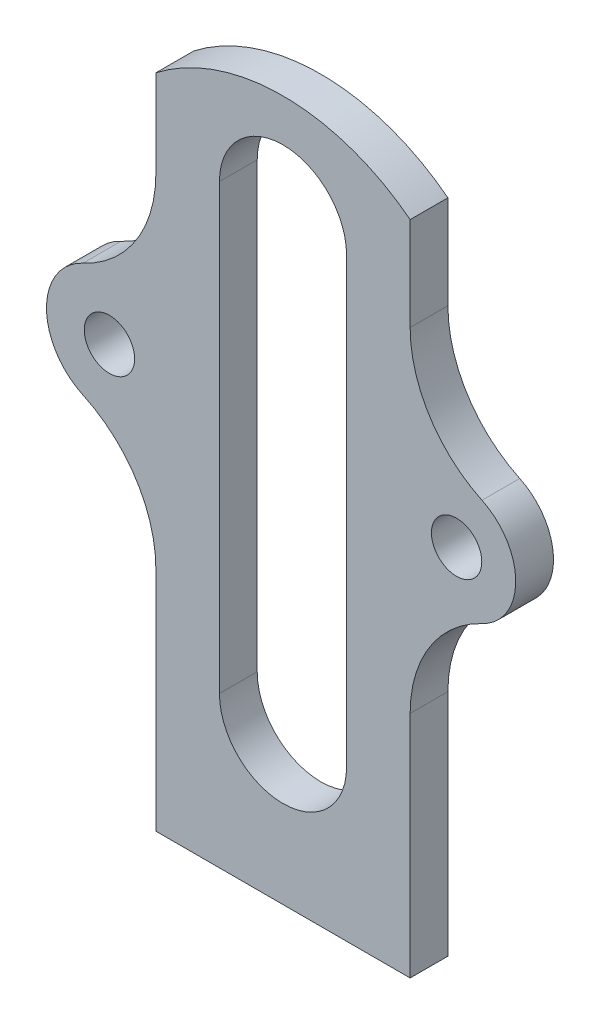
ISO-10303-21;
HEADER;
FILE_DESCRIPTION(('STEP AP214'),'2;1');
FILE_NAME('part.step','',(''),(''),'','','');
FILE_SCHEMA(('AUTOMOTIVE_DESIGN { 1 0 10303 214 1 1 1 1 }'));
ENDSEC;
DATA;
#1=APPLICATION_CONTEXT('core data for automotive mechanical design processes');
#2=APPLICATION_PROTOCOL_DEFINITION('international standard','automotive_design',2000,#1);
#3=PRODUCT_CONTEXT('',#1,'mechanical');
#4=PRODUCT('Part','Part','',(#3));
#5=PRODUCT_RELATED_PRODUCT_CATEGORY('part','',(#4));
#6=PRODUCT_DEFINITION_FORMATION('','',#4);
#7=PRODUCT_DEFINITION_CONTEXT('part definition',#1,'design');
#8=PRODUCT_DEFINITION('design','',#6,#7);
#9=PRODUCT_DEFINITION_SHAPE('','',#8);
#10=(LENGTH_UNIT() NAMED_UNIT(*) SI_UNIT(.MILLI.,.METRE.));
#11=(NAMED_UNIT(*) PLANE_ANGLE_UNIT() SI_UNIT($,.RADIAN.));
#12=(NAMED_UNIT(*) SI_UNIT($,.STERADIAN.) SOLID_ANGLE_UNIT());
#13=UNCERTAINTY_MEASURE_WITH_UNIT(LENGTH_MEASURE(1.E-05),#10,'distance_accuracy_value','');
#14=(GEOMETRIC_REPRESENTATION_CONTEXT(3) GLOBAL_UNCERTAINTY_ASSIGNED_CONTEXT((#13)) GLOBAL_UNIT_ASSIGNED_CONTEXT((#10,
#11,#12)) REPRESENTATION_CONTEXT('',''));
#15=CARTESIAN_POINT('',(0.,0.,0.));
#16=DIRECTION('',(0.,0.,1.));
#17=DIRECTION('',(1.,0.,0.));
#18=AXIS2_PLACEMENT_3D('',#15,#16,#17);
#19=CARTESIAN_POINT('',(0.,18.041981199993,23.));
#20=DIRECTION('',(-1.,0.,0.));
#21=DIRECTION('',(0.,-1.,0.));
#22=AXIS2_PLACEMENT_3D('',#19,#20,#21);
#23=PLANE('',#22);
#24=DIRECTION('',(0.,-1.,0.));
#25=VECTOR('',#24,1.);
#26=CARTESIAN_POINT('',(0.,18.041981199993,26.));
#27=LINE('',#26,#25);
#28=CARTESIAN_POINT('',(0.,18.041981199993,26.));
#29=VERTEX_POINT('',#28);
#30=CARTESIAN_POINT('',(0.,-1.07552855510562E-13,26.));
#31=VERTEX_POINT('',#30);
#32=EDGE_CURVE('E183',#29,#31,#27,.T.);
#33=ORIENTED_EDGE('',*,*,#32,.F.);
#34=DIRECTION('',(0.,0.,1.));
#35=VECTOR('',#34,1.);
#36=CARTESIAN_POINT('',(0.,18.041981199993,23.));
#37=LINE('',#36,#35);
#38=CARTESIAN_POINT('',(0.,18.041981199993,23.));
#39=VERTEX_POINT('',#38);
#40=EDGE_CURVE('E11',#39,#29,#37,.T.);
#41=ORIENTED_EDGE('',*,*,#40,.F.);
#42=DIRECTION('',(0.,-1.,0.));
#43=VECTOR('',#42,1.);
#44=CARTESIAN_POINT('',(0.,18.041981199993,23.));
#45=LINE('',#44,#43);
#46=CARTESIAN_POINT('',(0.,-1.07552855510562E-13,23.));
#47=VERTEX_POINT('',#46);
#48=EDGE_CURVE('E187',#39,#47,#45,.T.);
#49=ORIENTED_EDGE('',*,*,#48,.T.);
#50=DIRECTION('',(0.,0.,1.));
#51=VECTOR('',#50,1.);
#52=CARTESIAN_POINT('',(0.,-1.07552855510562E-13,23.));
#53=LINE('',#52,#51);
#54=EDGE_CURVE('E36',#47,#31,#53,.T.);
#55=ORIENTED_EDGE('',*,*,#54,.T.);
#56=EDGE_LOOP('',(#33,#41,#49,#55));
#57=FACE_BOUND('',#56,.T.);
#58=ADVANCED_FACE('F33',(#57),#23,.T.);
#59=CARTESIAN_POINT('',(-10.,18.041981199993,23.));
#60=DIRECTION('',(0.,0.,1.));
#61=DIRECTION('',(1.,0.,0.));
#62=AXIS2_PLACEMENT_3D('',#59,#60,#61);
#63=CYLINDRICAL_SURFACE('',#62,10.);
#64=CARTESIAN_POINT('',(-10.,18.041981199993,26.));
#65=DIRECTION('',(0.,0.,-1.));
#66=DIRECTION('',(1.,0.,0.));
#67=AXIS2_PLACEMENT_3D('',#64,#65,#66);
#68=CIRCLE('',#67,10.);
#69=CARTESIAN_POINT('',(-5.79333333333333,27.1141339519894,26.));
#70=VERTEX_POINT('',#69);
#71=EDGE_CURVE('E191',#70,#29,#68,.T.);
#72=ORIENTED_EDGE('',*,*,#71,.F.);
#73=DIRECTION('',(0.,0.,1.));
#74=VECTOR('',#73,1.);
#75=CARTESIAN_POINT('',(-5.79333333333333,27.1141339519894,23.));
#76=LINE('',#75,#74);
#77=CARTESIAN_POINT('',(-5.79333333333333,27.1141339519894,23.));
#78=VERTEX_POINT('',#77);
#79=EDGE_CURVE('E41',#78,#70,#76,.T.);
#80=ORIENTED_EDGE('',*,*,#79,.F.);
#81=CARTESIAN_POINT('',(-10.,18.041981199993,23.));
#82=DIRECTION('',(0.,0.,-1.));
#83=DIRECTION('',(1.,0.,0.));
#84=AXIS2_PLACEMENT_3D('',#81,#82,#83);
#85=CIRCLE('',#84,10.);
#86=EDGE_CURVE('E221',#78,#39,#85,.T.);
#87=ORIENTED_EDGE('',*,*,#86,.T.);
#88=ORIENTED_EDGE('',*,*,#40,.T.);
#89=EDGE_LOOP('',(#72,#80,#87,#88));
#90=FACE_BOUND('',#89,.T.);
#91=ADVANCED_FACE('F288',(#90),#63,.F.);
#92=CARTESIAN_POINT('',(-3.69,31.6502103279876,23.));
#93=DIRECTION('',(0.,0.,1.));
#94=DIRECTION('',(1.,0.,0.));
#95=AXIS2_PLACEMENT_3D('',#92,#93,#94);
#96=CYLINDRICAL_SURFACE('',#95,5.);
#97=CARTESIAN_POINT('',(-3.69,31.6502103279876,26.));
#98=DIRECTION('',(0.,0.,1.));
#99=DIRECTION('',(1.,0.,0.));
#100=AXIS2_PLACEMENT_3D('',#97,#98,#99);
#101=CIRCLE('',#100,5.);
#102=CARTESIAN_POINT('',(-5.79333333333333,36.1862867039858,26.));
#103=VERTEX_POINT('',#102);
#104=EDGE_CURVE('E253',#103,#70,#101,.T.);
#105=ORIENTED_EDGE('',*,*,#104,.F.);
#106=DIRECTION('',(0.,0.,1.));
#107=VECTOR('',#106,1.);
#108=CARTESIAN_POINT('',(-5.79333333333333,36.1862867039858,23.));
#109=LINE('',#108,#107);
#110=CARTESIAN_POINT('',(-5.79333333333333,36.1862867039858,23.));
#111=VERTEX_POINT('',#110);
#112=EDGE_CURVE('E259',#111,#103,#109,.T.);
#113=ORIENTED_EDGE('',*,*,#112,.F.);
#114=CARTESIAN_POINT('',(-3.69,31.6502103279876,23.));
#115=DIRECTION('',(0.,0.,1.));
#116=DIRECTION('',(1.,0.,0.));
#117=AXIS2_PLACEMENT_3D('',#114,#115,#116);
#118=CIRCLE('',#117,5.);
#119=EDGE_CURVE('E218',#111,#78,#118,.T.);
#120=ORIENTED_EDGE('',*,*,#119,.T.);
#121=ORIENTED_EDGE('',*,*,#79,.T.);
#122=EDGE_LOOP('',(#105,#113,#120,#121));
#123=FACE_BOUND('',#122,.T.);
#124=ADVANCED_FACE('F323',(#123),#96,.T.);
#125=CARTESIAN_POINT('',(-10.,45.2584394559822,23.));
#126=DIRECTION('',(0.,0.,1.));
#127=DIRECTION('',(1.,0.,0.));
#128=AXIS2_PLACEMENT_3D('',#125,#126,#127);
#129=CYLINDRICAL_SURFACE('',#128,10.);
#130=CARTESIAN_POINT('',(-10.,45.2584394559822,26.));
#131=DIRECTION('',(0.,0.,-1.));
#132=DIRECTION('',(-1.,0.,0.));
#133=AXIS2_PLACEMENT_3D('',#130,#131,#132);
#134=CIRCLE('',#133,10.);
#135=CARTESIAN_POINT('',(0.,45.2584394559822,26.));
#136=VERTEX_POINT('',#135);
#137=EDGE_CURVE('E250',#136,#103,#134,.T.);
#138=ORIENTED_EDGE('',*,*,#137,.F.);
#139=DIRECTION('',(0.,0.,1.));
#140=VECTOR('',#139,1.);
#141=CARTESIAN_POINT('',(0.,45.2584394559822,23.));
#142=LINE('',#141,#140);
#143=CARTESIAN_POINT('',(0.,45.2584394559822,23.));
#144=VERTEX_POINT('',#143);
#145=EDGE_CURVE('E261',#144,#136,#142,.T.);
#146=ORIENTED_EDGE('',*,*,#145,.F.);
#147=CARTESIAN_POINT('',(-10.,45.2584394559822,23.));
#148=DIRECTION('',(0.,0.,-1.));
#149=DIRECTION('',(-1.,0.,0.));
#150=AXIS2_PLACEMENT_3D('',#147,#148,#149);
#151=CIRCLE('',#150,10.);
#152=EDGE_CURVE('E215',#144,#111,#151,.T.);
#153=ORIENTED_EDGE('',*,*,#152,.T.);
#154=ORIENTED_EDGE('',*,*,#112,.T.);
#155=EDGE_LOOP('',(#138,#146,#153,#154));
#156=FACE_BOUND('',#155,.T.);
#157=ADVANCED_FACE('F320',(#156),#129,.F.);
#158=CARTESIAN_POINT('',(0.,52.1796300253283,23.));
#159=DIRECTION('',(-1.,0.,0.));
#160=DIRECTION('',(0.,-1.,0.));
#161=AXIS2_PLACEMENT_3D('',#158,#159,#160);
#162=PLANE('',#161);
#163=DIRECTION('',(0.,-1.,0.));
#164=VECTOR('',#163,1.);
#165=CARTESIAN_POINT('',(0.,52.1796300253283,26.));
#166=LINE('',#165,#164);
#167=CARTESIAN_POINT('',(0.,52.1796300253283,26.));
#168=VERTEX_POINT('',#167);
#169=EDGE_CURVE('E247',#168,#136,#166,.T.);
#170=ORIENTED_EDGE('',*,*,#169,.F.);
#171=DIRECTION('',(0.,0.,1.));
#172=VECTOR('',#171,1.);
#173=CARTESIAN_POINT('',(0.,52.1796300253283,23.));
#174=LINE('',#173,#172);
#175=CARTESIAN_POINT('',(0.,52.1796300253283,23.));
#176=VERTEX_POINT('',#175);
#177=EDGE_CURVE('E263',#176,#168,#174,.T.);
#178=ORIENTED_EDGE('',*,*,#177,.F.);
#179=DIRECTION('',(0.,-1.,0.));
#180=VECTOR('',#179,1.);
#181=CARTESIAN_POINT('',(0.,52.1796300253283,23.));
#182=LINE('',#181,#180);
#183=EDGE_CURVE('E212',#176,#144,#182,.T.);
#184=ORIENTED_EDGE('',*,*,#183,.T.);
#185=ORIENTED_EDGE('',*,*,#145,.T.);
#186=EDGE_LOOP('',(#170,#178,#184,#185));
#187=FACE_BOUND('',#186,.T.);
#188=ADVANCED_FACE('F317',(#187),#162,.T.);
#189=CARTESIAN_POINT('',(10.1,39.1850926484792,23.));
#190=DIRECTION('',(0.,0.,1.));
#191=DIRECTION('',(1.,0.,0.));
#192=AXIS2_PLACEMENT_3D('',#189,#190,#191);
#193=CYLINDRICAL_SURFACE('',#192,16.4580679801224);
#194=CARTESIAN_POINT('',(10.1,39.1850926484792,26.));
#195=DIRECTION('',(0.,0.,1.));
#196=DIRECTION('',(1.,0.,0.));
#197=AXIS2_PLACEMENT_3D('',#194,#195,#196);
#198=CIRCLE('',#197,16.4580679801224);
#199=CARTESIAN_POINT('',(20.2,52.1796300253283,26.));
#200=VERTEX_POINT('',#199);
#201=EDGE_CURVE('E244',#200,#168,#198,.T.);
#202=ORIENTED_EDGE('',*,*,#201,.F.);
#203=DIRECTION('',(0.,0.,1.));
#204=VECTOR('',#203,1.);
#205=CARTESIAN_POINT('',(20.2,52.1796300253283,23.));
#206=LINE('',#205,#204);
#207=CARTESIAN_POINT('',(20.2,52.1796300253283,23.));
#208=VERTEX_POINT('',#207);
#209=EDGE_CURVE('E265',#208,#200,#206,.T.);
#210=ORIENTED_EDGE('',*,*,#209,.F.);
#211=CARTESIAN_POINT('',(10.1,39.1850926484792,23.));
#212=DIRECTION('',(0.,0.,1.));
#213=DIRECTION('',(1.,0.,0.));
#214=AXIS2_PLACEMENT_3D('',#211,#212,#213);
#215=CIRCLE('',#214,16.4580679801224);
#216=EDGE_CURVE('E209',#208,#176,#215,.T.);
#217=ORIENTED_EDGE('',*,*,#216,.T.);
#218=ORIENTED_EDGE('',*,*,#177,.T.);
#219=EDGE_LOOP('',(#202,#210,#217,#218));
#220=FACE_BOUND('',#219,.T.);
#221=ADVANCED_FACE('F313',(#220),#193,.T.);
#222=CARTESIAN_POINT('',(20.2,44.754426549422,23.));
#223=DIRECTION('',(1.,0.,0.));
#224=DIRECTION('',(0.,1.,0.));
#225=AXIS2_PLACEMENT_3D('',#222,#223,#224);
#226=PLANE('',#225);
#227=DIRECTION('',(0.,1.,0.));
#228=VECTOR('',#227,1.);
#229=CARTESIAN_POINT('',(20.2,44.754426549422,26.));
#230=LINE('',#229,#228);
#231=CARTESIAN_POINT('',(20.2,44.754426549422,26.));
#232=VERTEX_POINT('',#231);
#233=EDGE_CURVE('E241',#232,#200,#230,.T.);
#234=ORIENTED_EDGE('',*,*,#233,.F.);
#235=DIRECTION('',(0.,0.,1.));
#236=VECTOR('',#235,1.);
#237=CARTESIAN_POINT('',(20.2,44.754426549422,23.));
#238=LINE('',#237,#236);
#239=CARTESIAN_POINT('',(20.2,44.754426549422,23.));
#240=VERTEX_POINT('',#239);
#241=EDGE_CURVE('E267',#240,#232,#238,.T.);
#242=ORIENTED_EDGE('',*,*,#241,.F.);
#243=DIRECTION('',(0.,1.,0.));
#244=VECTOR('',#243,1.);
#245=CARTESIAN_POINT('',(20.2,44.754426549422,23.));
#246=LINE('',#245,#244);
#247=EDGE_CURVE('E206',#240,#208,#246,.T.);
#248=ORIENTED_EDGE('',*,*,#247,.T.);
#249=ORIENTED_EDGE('',*,*,#209,.T.);
#250=EDGE_LOOP('',(#234,#242,#248,#249));
#251=FACE_BOUND('',#250,.T.);
#252=ADVANCED_FACE('F309',(#251),#226,.T.);
#253=CARTESIAN_POINT('',(30.2,44.754426549422,23.));
#254=DIRECTION('',(0.,0.,1.));
#255=DIRECTION('',(1.,0.,0.));
#256=AXIS2_PLACEMENT_3D('',#253,#254,#255);
#257=CYLINDRICAL_SURFACE('',#256,10.);
#258=CARTESIAN_POINT('',(30.2,44.754426549422,26.));
#259=DIRECTION('',(0.,0.,-1.));
#260=DIRECTION('',(1.,0.,0.));
#261=AXIS2_PLACEMENT_3D('',#258,#259,#260);
#262=CIRCLE('',#261,10.);
#263=CARTESIAN_POINT('',(25.9066936686278,35.7229526528202,26.));
#264=VERTEX_POINT('',#263);
#265=EDGE_CURVE('E238',#264,#232,#262,.T.);
#266=ORIENTED_EDGE('',*,*,#265,.F.);
#267=DIRECTION('',(0.,0.,1.));
#268=VECTOR('',#267,1.);
#269=CARTESIAN_POINT('',(25.9066936686278,35.7229526528202,23.));
#270=LINE('',#269,#268);
#271=CARTESIAN_POINT('',(25.9066936686278,35.7229526528202,23.));
#272=VERTEX_POINT('',#271);
#273=EDGE_CURVE('E269',#272,#264,#270,.T.);
#274=ORIENTED_EDGE('',*,*,#273,.F.);
#275=CARTESIAN_POINT('',(30.2,44.754426549422,23.));
#276=DIRECTION('',(0.,0.,-1.));
#277=DIRECTION('',(1.,0.,0.));
#278=AXIS2_PLACEMENT_3D('',#275,#276,#277);
#279=CIRCLE('',#278,10.);
#280=EDGE_CURVE('E203',#272,#240,#279,.T.);
#281=ORIENTED_EDGE('',*,*,#280,.T.);
#282=ORIENTED_EDGE('',*,*,#241,.T.);
#283=EDGE_LOOP('',(#266,#274,#281,#282));
#284=FACE_BOUND('',#283,.T.);
#285=ADVANCED_FACE('F305',(#284),#257,.F.);
#286=CARTESIAN_POINT('',(23.89,31.4806007636569,23.));
#287=DIRECTION('',(0.,0.,1.));
#288=DIRECTION('',(1.,0.,0.));
#289=AXIS2_PLACEMENT_3D('',#286,#287,#288);
#290=CYLINDRICAL_SURFACE('',#289,4.69729740431352);
#291=CARTESIAN_POINT('',(23.89,31.4806007636569,26.));
#292=DIRECTION('',(0.,0.,1.));
#293=DIRECTION('',(1.,0.,0.));
#294=AXIS2_PLACEMENT_3D('',#291,#292,#293);
#295=CIRCLE('',#294,4.69729740431352);
#296=CARTESIAN_POINT('',(25.9066936686278,27.2382488744936,26.));
#297=VERTEX_POINT('',#296);
#298=EDGE_CURVE('E235',#297,#264,#295,.T.);
#299=ORIENTED_EDGE('',*,*,#298,.F.);
#300=DIRECTION('',(0.,0.,1.));
#301=VECTOR('',#300,1.);
#302=CARTESIAN_POINT('',(25.9066936686278,27.2382488744936,23.));
#303=LINE('',#302,#301);
#304=CARTESIAN_POINT('',(25.9066936686278,27.2382488744936,23.));
#305=VERTEX_POINT('',#304);
#306=EDGE_CURVE('E271',#305,#297,#303,.T.);
#307=ORIENTED_EDGE('',*,*,#306,.F.);
#308=CARTESIAN_POINT('',(23.89,31.4806007636569,23.));
#309=DIRECTION('',(0.,0.,1.));
#310=DIRECTION('',(1.,0.,0.));
#311=AXIS2_PLACEMENT_3D('',#308,#309,#310);
#312=CIRCLE('',#311,4.69729740431352);
#313=EDGE_CURVE('E200',#305,#272,#312,.T.);
#314=ORIENTED_EDGE('',*,*,#313,.T.);
#315=ORIENTED_EDGE('',*,*,#273,.T.);
#316=EDGE_LOOP('',(#299,#307,#314,#315));
#317=FACE_BOUND('',#316,.T.);
#318=ADVANCED_FACE('F301',(#317),#290,.T.);
#319=CARTESIAN_POINT('',(30.2,18.2067749778919,23.));
#320=DIRECTION('',(0.,0.,1.));
#321=DIRECTION('',(1.,0.,0.));
#322=AXIS2_PLACEMENT_3D('',#319,#320,#321);
#323=CYLINDRICAL_SURFACE('',#322,10.);
#324=CARTESIAN_POINT('',(30.2,18.2067749778919,26.));
#325=DIRECTION('',(0.,0.,-1.));
#326=DIRECTION('',(-1.,0.,0.));
#327=AXIS2_PLACEMENT_3D('',#324,#325,#326);
#328=CIRCLE('',#327,10.);
#329=CARTESIAN_POINT('',(20.2,18.2067749778919,26.));
#330=VERTEX_POINT('',#329);
#331=EDGE_CURVE('E232',#330,#297,#328,.T.);
#332=ORIENTED_EDGE('',*,*,#331,.F.);
#333=DIRECTION('',(0.,0.,1.));
#334=VECTOR('',#333,1.);
#335=CARTESIAN_POINT('',(20.2,18.2067749778919,23.));
#336=LINE('',#335,#334);
#337=CARTESIAN_POINT('',(20.2,18.2067749778919,23.));
#338=VERTEX_POINT('',#337);
#339=EDGE_CURVE('E273',#338,#330,#336,.T.);
#340=ORIENTED_EDGE('',*,*,#339,.F.);
#341=CARTESIAN_POINT('',(30.2,18.2067749778919,23.));
#342=DIRECTION('',(0.,0.,-1.));
#343=DIRECTION('',(-1.,0.,0.));
#344=AXIS2_PLACEMENT_3D('',#341,#342,#343);
#345=CIRCLE('',#344,10.);
#346=EDGE_CURVE('E197',#338,#305,#345,.T.);
#347=ORIENTED_EDGE('',*,*,#346,.T.);
#348=ORIENTED_EDGE('',*,*,#306,.T.);
#349=EDGE_LOOP('',(#332,#340,#347,#348));
#350=FACE_BOUND('',#349,.T.);
#351=ADVANCED_FACE('F299',(#350),#323,.F.);
#352=CARTESIAN_POINT('',(20.2,-1.07552855510562E-13,23.));
#353=DIRECTION('',(1.,0.,0.));
#354=DIRECTION('',(0.,1.,0.));
#355=AXIS2_PLACEMENT_3D('',#352,#353,#354);
#356=PLANE('',#355);
#357=DIRECTION('',(0.,1.,0.));
#358=VECTOR('',#357,1.);
#359=CARTESIAN_POINT('',(20.2,-1.07552855510562E-13,26.));
#360=LINE('',#359,#358);
#361=CARTESIAN_POINT('',(20.2,-1.07552855510562E-13,26.));
#362=VERTEX_POINT('',#361);
#363=EDGE_CURVE('E229',#362,#330,#360,.T.);
#364=ORIENTED_EDGE('',*,*,#363,.F.);
#365=DIRECTION('',(0.,0.,1.));
#366=VECTOR('',#365,1.);
#367=CARTESIAN_POINT('',(20.2,-1.07552855510562E-13,23.));
#368=LINE('',#367,#366);
#369=CARTESIAN_POINT('',(20.2,-1.07552855510562E-13,23.));
#370=VERTEX_POINT('',#369);
#371=EDGE_CURVE('E274',#370,#362,#368,.T.);
#372=ORIENTED_EDGE('',*,*,#371,.F.);
#373=DIRECTION('',(0.,1.,0.));
#374=VECTOR('',#373,1.);
#375=CARTESIAN_POINT('',(20.2,-1.07552855510562E-13,23.));
#376=LINE('',#375,#374);
#377=EDGE_CURVE('E194',#370,#338,#376,.T.);
#378=ORIENTED_EDGE('',*,*,#377,.T.);
#379=ORIENTED_EDGE('',*,*,#339,.T.);
#380=EDGE_LOOP('',(#364,#372,#378,#379));
#381=FACE_BOUND('',#380,.T.);
#382=ADVANCED_FACE('F295',(#381),#356,.T.);
#383=CARTESIAN_POINT('',(0.,-1.07552855510562E-13,23.));
#384=DIRECTION('',(0.,-1.,0.));
#385=DIRECTION('',(0.,0.,-1.));
#386=AXIS2_PLACEMENT_3D('',#383,#384,#385);
#387=PLANE('',#386);
#388=DIRECTION('',(1.,0.,0.));
#389=VECTOR('',#388,1.);
#390=CARTESIAN_POINT('',(0.,-1.07552855510562E-13,26.));
#391=LINE('',#390,#389);
#392=EDGE_CURVE('E226',#31,#362,#391,.T.);
#393=ORIENTED_EDGE('',*,*,#392,.F.);
#394=ORIENTED_EDGE('',*,*,#54,.F.);
#395=DIRECTION('',(1.,0.,0.));
#396=VECTOR('',#395,1.);
#397=CARTESIAN_POINT('',(0.,-1.07552855510562E-13,23.));
#398=LINE('',#397,#396);
#399=EDGE_CURVE('E190',#47,#370,#398,.T.);
#400=ORIENTED_EDGE('',*,*,#399,.T.);
#401=ORIENTED_EDGE('',*,*,#371,.T.);
#402=EDGE_LOOP('',(#393,#394,#400,#401));
#403=FACE_BOUND('',#402,.T.);
#404=ADVANCED_FACE('F282',(#403),#387,.T.);
#405=CARTESIAN_POINT('',(30.2,18.2067749778919,23.));
#406=DIRECTION('',(0.,0.,-1.));
#407=DIRECTION('',(-1.,0.,0.));
#408=AXIS2_PLACEMENT_3D('',#405,#406,#407);
#409=PLANE('',#408);
#410=CARTESIAN_POINT('',(23.89,31.4806007636569,23.));
#411=DIRECTION('',(0.,0.,1.));
#412=DIRECTION('',(1.,0.,0.));
#413=AXIS2_PLACEMENT_3D('',#410,#411,#412);
#414=CIRCLE('',#413,1.99999999999986);
#415=CARTESIAN_POINT('',(25.8899999999999,31.4806007636569,23.));
#416=VERTEX_POINT('',#415);
#417=EDGE_CURVE('E492',#416,#416,#414,.T.);
#418=ORIENTED_EDGE('',*,*,#417,.T.);
#419=EDGE_LOOP('',(#418));
#420=FACE_BOUND('',#419,.T.);
#421=CARTESIAN_POINT('',(-3.69,31.6502103279876,23.));
#422=DIRECTION('',(0.,0.,1.));
#423=DIRECTION('',(1.,0.,0.));
#424=AXIS2_PLACEMENT_3D('',#421,#422,#423);
#425=CIRCLE('',#424,2.);
#426=CARTESIAN_POINT('',(-1.69,31.6502103279876,23.));
#427=VERTEX_POINT('',#426);
#428=EDGE_CURVE('E177',#427,#427,#425,.T.);
#429=ORIENTED_EDGE('',*,*,#428,.T.);
#430=EDGE_LOOP('',(#429));
#431=FACE_BOUND('',#430,.T.);
#432=CARTESIAN_POINT('',(10.1,12.,23.));
#433=DIRECTION('',(0.,0.,1.));
#434=DIRECTION('',(1.,0.,0.));
#435=AXIS2_PLACEMENT_3D('',#432,#433,#434);
#436=CIRCLE('',#435,5.05);
#437=CARTESIAN_POINT('',(5.05,12.,23.));
#438=VERTEX_POINT('',#437);
#439=CARTESIAN_POINT('',(15.15,12.,23.));
#440=VERTEX_POINT('',#439);
#441=EDGE_CURVE('E148',#438,#440,#436,.T.);
#442=ORIENTED_EDGE('',*,*,#441,.T.);
#443=DIRECTION('',(0.,1.,0.));
#444=VECTOR('',#443,1.);
#445=CARTESIAN_POINT('',(15.15,12.,23.));
#446=LINE('',#445,#444);
#447=CARTESIAN_POINT('',(15.15,47.2223420938085,23.));
#448=VERTEX_POINT('',#447);
#449=EDGE_CURVE('E157',#440,#448,#446,.T.);
#450=ORIENTED_EDGE('',*,*,#449,.T.);
#451=CARTESIAN_POINT('',(10.1,47.2223420938085,23.));
#452=DIRECTION('',(0.,0.,1.));
#453=DIRECTION('',(1.,0.,0.));
#454=AXIS2_PLACEMENT_3D('',#451,#452,#453);
#455=CIRCLE('',#454,5.04999999999999);
#456=CARTESIAN_POINT('',(5.05000000000003,47.2223420938085,23.));
#457=VERTEX_POINT('',#456);
#458=EDGE_CURVE('E49',#448,#457,#455,.T.);
#459=ORIENTED_EDGE('',*,*,#458,.T.);
#460=DIRECTION('',(0.,-1.,0.));
#461=VECTOR('',#460,1.);
#462=CARTESIAN_POINT('',(5.05000000000003,47.2223420938085,23.));
#463=LINE('',#462,#461);
#464=EDGE_CURVE('E154',#457,#438,#463,.T.);
#465=ORIENTED_EDGE('',*,*,#464,.T.);
#466=EDGE_LOOP('',(#442,#450,#459,#465));
#467=FACE_BOUND('',#466,.T.);
#468=ORIENTED_EDGE('',*,*,#48,.F.);
#469=ORIENTED_EDGE('',*,*,#86,.F.);
#470=ORIENTED_EDGE('',*,*,#119,.F.);
#471=ORIENTED_EDGE('',*,*,#152,.F.);
#472=ORIENTED_EDGE('',*,*,#183,.F.);
#473=ORIENTED_EDGE('',*,*,#216,.F.);
#474=ORIENTED_EDGE('',*,*,#247,.F.);
#475=ORIENTED_EDGE('',*,*,#280,.F.);
#476=ORIENTED_EDGE('',*,*,#313,.F.);
#477=ORIENTED_EDGE('',*,*,#346,.F.);
#478=ORIENTED_EDGE('',*,*,#377,.F.);
#479=ORIENTED_EDGE('',*,*,#399,.F.);
#480=EDGE_LOOP('',(#468,#469,#470,#471,#472,#473,#474,#475,#476,#477,#478,#479));
#481=FACE_BOUND('',#480,.T.);
#482=ADVANCED_FACE('F161',(#420,#431,#467,#481),#409,.T.);
#483=CARTESIAN_POINT('',(30.2,18.2067749778919,26.));
#484=DIRECTION('',(0.,0.,-1.));
#485=DIRECTION('',(-1.,0.,0.));
#486=AXIS2_PLACEMENT_3D('',#483,#484,#485);
#487=PLANE('',#486);
#488=CARTESIAN_POINT('',(23.89,31.4806007636569,26.));
#489=DIRECTION('',(0.,0.,1.));
#490=DIRECTION('',(1.,0.,0.));
#491=AXIS2_PLACEMENT_3D('',#488,#489,#490);
#492=CIRCLE('',#491,1.99999999999986);
#493=CARTESIAN_POINT('',(25.8899999999999,31.4806007636569,26.));
#494=VERTEX_POINT('',#493);
#495=EDGE_CURVE('E495',#494,#494,#492,.T.);
#496=ORIENTED_EDGE('',*,*,#495,.F.);
#497=EDGE_LOOP('',(#496));
#498=FACE_BOUND('',#497,.T.);
#499=CARTESIAN_POINT('',(-3.69,31.6502103279876,26.));
#500=DIRECTION('',(0.,0.,1.));
#501=DIRECTION('',(1.,0.,0.));
#502=AXIS2_PLACEMENT_3D('',#499,#500,#501);
#503=CIRCLE('',#502,2.);
#504=CARTESIAN_POINT('',(-1.69,31.6502103279876,26.));
#505=VERTEX_POINT('',#504);
#506=EDGE_CURVE('E170',#505,#505,#503,.T.);
#507=ORIENTED_EDGE('',*,*,#506,.F.);
#508=EDGE_LOOP('',(#507));
#509=FACE_BOUND('',#508,.T.);
#510=DIRECTION('',(0.,1.,0.));
#511=VECTOR('',#510,1.);
#512=CARTESIAN_POINT('',(15.15,12.,26.));
#513=LINE('',#512,#511);
#514=CARTESIAN_POINT('',(15.15,12.,26.));
#515=VERTEX_POINT('',#514);
#516=CARTESIAN_POINT('',(15.15,47.2223420938085,26.));
#517=VERTEX_POINT('',#516);
#518=EDGE_CURVE('E176',#515,#517,#513,.T.);
#519=ORIENTED_EDGE('',*,*,#518,.F.);
#520=CARTESIAN_POINT('',(10.1,12.,26.));
#521=DIRECTION('',(0.,0.,1.));
#522=DIRECTION('',(1.,0.,0.));
#523=AXIS2_PLACEMENT_3D('',#520,#521,#522);
#524=CIRCLE('',#523,5.05);
#525=CARTESIAN_POINT('',(5.05,12.,26.));
#526=VERTEX_POINT('',#525);
#527=EDGE_CURVE('E57',#526,#515,#524,.T.);
#528=ORIENTED_EDGE('',*,*,#527,.F.);
#529=DIRECTION('',(0.,-1.,0.));
#530=VECTOR('',#529,1.);
#531=CARTESIAN_POINT('',(5.05000000000003,47.2223420938085,26.));
#532=LINE('',#531,#530);
#533=CARTESIAN_POINT('',(5.05000000000003,47.2223420938085,26.));
#534=VERTEX_POINT('',#533);
#535=EDGE_CURVE('E164',#534,#526,#532,.T.);
#536=ORIENTED_EDGE('',*,*,#535,.F.);
#537=CARTESIAN_POINT('',(10.1,47.2223420938085,26.));
#538=DIRECTION('',(0.,0.,1.));
#539=DIRECTION('',(1.,0.,0.));
#540=AXIS2_PLACEMENT_3D('',#537,#538,#539);
#541=CIRCLE('',#540,5.04999999999999);
#542=EDGE_CURVE('E167',#517,#534,#541,.T.);
#543=ORIENTED_EDGE('',*,*,#542,.F.);
#544=EDGE_LOOP('',(#519,#528,#536,#543));
#545=FACE_BOUND('',#544,.T.);
#546=ORIENTED_EDGE('',*,*,#32,.T.);
#547=ORIENTED_EDGE('',*,*,#392,.T.);
#548=ORIENTED_EDGE('',*,*,#363,.T.);
#549=ORIENTED_EDGE('',*,*,#331,.T.);
#550=ORIENTED_EDGE('',*,*,#298,.T.);
#551=ORIENTED_EDGE('',*,*,#265,.T.);
#552=ORIENTED_EDGE('',*,*,#233,.T.);
#553=ORIENTED_EDGE('',*,*,#201,.T.);
#554=ORIENTED_EDGE('',*,*,#169,.T.);
#555=ORIENTED_EDGE('',*,*,#137,.T.);
#556=ORIENTED_EDGE('',*,*,#104,.T.);
#557=ORIENTED_EDGE('',*,*,#71,.T.);
#558=EDGE_LOOP('',(#546,#547,#548,#549,#550,#551,#552,#553,#554,#555,#556,#557));
#559=FACE_BOUND('',#558,.T.);
#560=ADVANCED_FACE('F284',(#498,#509,#545,#559),#487,.F.);
#561=CARTESIAN_POINT('',(10.1,12.,23.));
#562=DIRECTION('',(0.,0.,1.));
#563=DIRECTION('',(1.,0.,0.));
#564=AXIS2_PLACEMENT_3D('',#561,#562,#563);
#565=CYLINDRICAL_SURFACE('',#564,5.05);
#566=ORIENTED_EDGE('',*,*,#527,.T.);
#567=DIRECTION('',(0.,0.,1.));
#568=VECTOR('',#567,1.);
#569=CARTESIAN_POINT('',(15.15,12.,23.));
#570=LINE('',#569,#568);
#571=EDGE_CURVE('E144',#440,#515,#570,.T.);
#572=ORIENTED_EDGE('',*,*,#571,.F.);
#573=ORIENTED_EDGE('',*,*,#441,.F.);
#574=DIRECTION('',(0.,0.,1.));
#575=VECTOR('',#574,1.);
#576=CARTESIAN_POINT('',(5.05,12.,23.));
#577=LINE('',#576,#575);
#578=EDGE_CURVE('E181',#438,#526,#577,.T.);
#579=ORIENTED_EDGE('',*,*,#578,.T.);
#580=EDGE_LOOP('',(#566,#572,#573,#579));
#581=FACE_BOUND('',#580,.T.);
#582=ADVANCED_FACE('F146',(#581),#565,.F.);
#583=CARTESIAN_POINT('',(5.05000000000003,47.2223420938085,23.));
#584=DIRECTION('',(-1.,0.,0.));
#585=DIRECTION('',(0.,-1.,0.));
#586=AXIS2_PLACEMENT_3D('',#583,#584,#585);
#587=PLANE('',#586);
#588=ORIENTED_EDGE('',*,*,#535,.T.);
#589=ORIENTED_EDGE('',*,*,#578,.F.);
#590=ORIENTED_EDGE('',*,*,#464,.F.);
#591=DIRECTION('',(0.,0.,1.));
#592=VECTOR('',#591,1.);
#593=CARTESIAN_POINT('',(5.05000000000003,47.2223420938085,23.));
#594=LINE('',#593,#592);
#595=EDGE_CURVE('E184',#457,#534,#594,.T.);
#596=ORIENTED_EDGE('',*,*,#595,.T.);
#597=EDGE_LOOP('',(#588,#589,#590,#596));
#598=FACE_BOUND('',#597,.T.);
#599=ADVANCED_FACE('F439',(#598),#587,.F.);
#600=CARTESIAN_POINT('',(10.1,47.2223420938085,23.));
#601=DIRECTION('',(0.,0.,1.));
#602=DIRECTION('',(1.,0.,0.));
#603=AXIS2_PLACEMENT_3D('',#600,#601,#602);
#604=CYLINDRICAL_SURFACE('',#603,5.04999999999999);
#605=ORIENTED_EDGE('',*,*,#542,.T.);
#606=ORIENTED_EDGE('',*,*,#595,.F.);
#607=ORIENTED_EDGE('',*,*,#458,.F.);
#608=DIRECTION('',(0.,0.,1.));
#609=VECTOR('',#608,1.);
#610=CARTESIAN_POINT('',(15.15,47.2223420938085,23.));
#611=LINE('',#610,#609);
#612=EDGE_CURVE('E153',#448,#517,#611,.T.);
#613=ORIENTED_EDGE('',*,*,#612,.T.);
#614=EDGE_LOOP('',(#605,#606,#607,#613));
#615=FACE_BOUND('',#614,.T.);
#616=ADVANCED_FACE('F448',(#615),#604,.F.);
#617=CARTESIAN_POINT('',(15.15,12.,23.));
#618=DIRECTION('',(1.,0.,0.));
#619=DIRECTION('',(0.,1.,0.));
#620=AXIS2_PLACEMENT_3D('',#617,#618,#619);
#621=PLANE('',#620);
#622=ORIENTED_EDGE('',*,*,#518,.T.);
#623=ORIENTED_EDGE('',*,*,#612,.F.);
#624=ORIENTED_EDGE('',*,*,#449,.F.);
#625=ORIENTED_EDGE('',*,*,#571,.T.);
#626=EDGE_LOOP('',(#622,#623,#624,#625));
#627=FACE_BOUND('',#626,.T.);
#628=ADVANCED_FACE('F158',(#627),#621,.F.);
#629=CARTESIAN_POINT('',(-3.69,31.6502103279876,23.));
#630=DIRECTION('',(0.,0.,1.));
#631=DIRECTION('',(1.,0.,0.));
#632=AXIS2_PLACEMENT_3D('',#629,#630,#631);
#633=CYLINDRICAL_SURFACE('',#632,2.);
#634=ORIENTED_EDGE('',*,*,#428,.F.);
#635=EDGE_LOOP('',(#634));
#636=FACE_BOUND('',#635,.T.);
#637=ORIENTED_EDGE('',*,*,#506,.T.);
#638=EDGE_LOOP('',(#637));
#639=FACE_BOUND('',#638,.T.);
#640=ADVANCED_FACE('F466',(#636,#639),#633,.F.);
#641=CARTESIAN_POINT('',(23.89,31.4806007636569,23.));
#642=DIRECTION('',(0.,0.,1.));
#643=DIRECTION('',(1.,0.,0.));
#644=AXIS2_PLACEMENT_3D('',#641,#642,#643);
#645=CYLINDRICAL_SURFACE('',#644,1.99999999999986);
#646=ORIENTED_EDGE('',*,*,#417,.F.);
#647=EDGE_LOOP('',(#646));
#648=FACE_BOUND('',#647,.T.);
#649=ORIENTED_EDGE('',*,*,#495,.T.);
#650=EDGE_LOOP('',(#649));
#651=FACE_BOUND('',#650,.T.);
#652=ADVANCED_FACE('F475',(#648,#651),#645,.F.);
#653=CLOSED_SHELL('',(#58,#91,#124,#157,#188,#221,#252,#285,#318,#351,#382,#404,#482,#560,#582,
#599,#616,#628,#640,#652));
#654=MANIFOLD_SOLID_BREP('B2',#653);
#655=ADVANCED_BREP_SHAPE_REPRESENTATION('',(#18,#654),#14);
#656=SHAPE_DEFINITION_REPRESENTATION(#9,#655);
ENDSEC;
END-ISO-10303-21;
